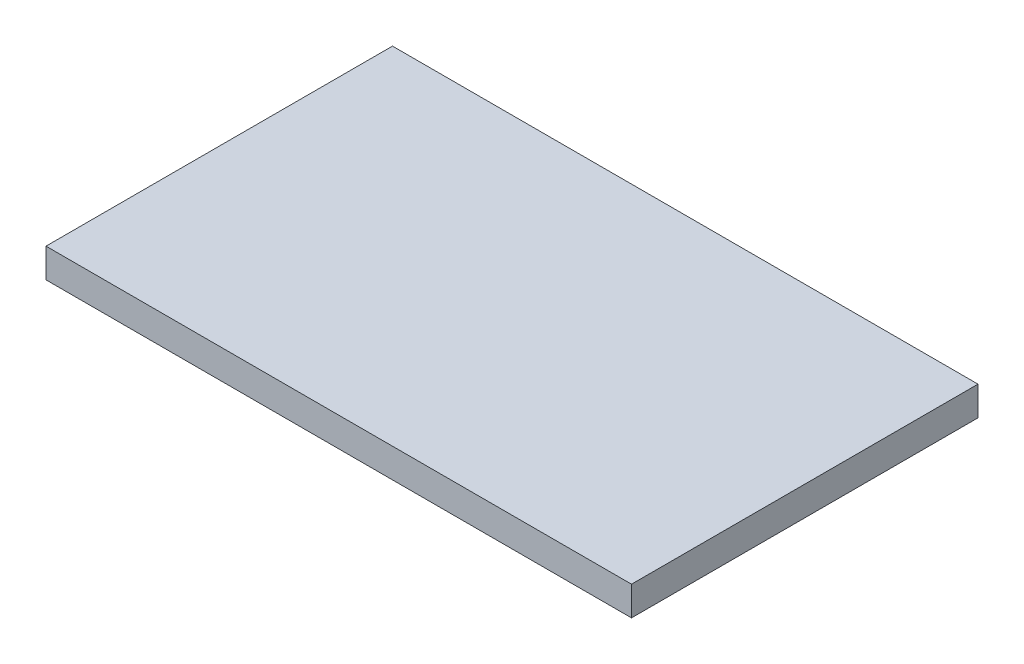
ISO-10303-21;
HEADER;
FILE_DESCRIPTION(('STEP AP214'),'2;1');
FILE_NAME('part.step','',(''),(''),'','','');
FILE_SCHEMA(('AUTOMOTIVE_DESIGN { 1 0 10303 214 1 1 1 1 }'));
ENDSEC;
DATA;
#1=APPLICATION_CONTEXT('core data for automotive mechanical design processes');
#2=APPLICATION_PROTOCOL_DEFINITION('international standard','automotive_design',2000,#1);
#3=PRODUCT_CONTEXT('',#1,'mechanical');
#4=PRODUCT('Part','Part','',(#3));
#5=PRODUCT_RELATED_PRODUCT_CATEGORY('part','',(#4));
#6=PRODUCT_DEFINITION_FORMATION('','',#4);
#7=PRODUCT_DEFINITION_CONTEXT('part definition',#1,'design');
#8=PRODUCT_DEFINITION('design','',#6,#7);
#9=PRODUCT_DEFINITION_SHAPE('','',#8);
#10=(LENGTH_UNIT() NAMED_UNIT(*) SI_UNIT(.MILLI.,.METRE.));
#11=(NAMED_UNIT(*) PLANE_ANGLE_UNIT() SI_UNIT($,.RADIAN.));
#12=(NAMED_UNIT(*) SI_UNIT($,.STERADIAN.) SOLID_ANGLE_UNIT());
#13=UNCERTAINTY_MEASURE_WITH_UNIT(LENGTH_MEASURE(1.E-05),#10,'distance_accuracy_value','');
#14=(GEOMETRIC_REPRESENTATION_CONTEXT(3) GLOBAL_UNCERTAINTY_ASSIGNED_CONTEXT((#13)) GLOBAL_UNIT_ASSIGNED_CONTEXT((#10,
#11,#12)) REPRESENTATION_CONTEXT('',''));
#15=CARTESIAN_POINT('',(0.,0.,0.));
#16=DIRECTION('',(0.,0.,1.));
#17=DIRECTION('',(1.,0.,0.));
#18=AXIS2_PLACEMENT_3D('',#15,#16,#17);
#19=CARTESIAN_POINT('',(0.,0.,0.));
#20=DIRECTION('',(0.,0.,-1.));
#21=DIRECTION('',(-1.,0.,0.));
#22=AXIS2_PLACEMENT_3D('',#19,#20,#21);
#23=PLANE('',#22);
#24=DIRECTION('',(1.,0.,0.));
#25=VECTOR('',#24,1.);
#26=CARTESIAN_POINT('',(190.95,-161.090734030885,0.));
#27=LINE('',#26,#25);
#28=CARTESIAN_POINT('',(-190.95,-161.090734030885,0.));
#29=VERTEX_POINT('',#28);
#30=CARTESIAN_POINT('',(190.95,-161.090734030885,0.));
#31=VERTEX_POINT('',#30);
#32=EDGE_CURVE('E76',#29,#31,#27,.T.);
#33=ORIENTED_EDGE('',*,*,#32,.F.);
#34=DIRECTION('',(0.,-1.,0.));
#35=VECTOR('',#34,1.);
#36=CARTESIAN_POINT('',(-190.95,-151.565734030885,0.));
#37=LINE('',#36,#35);
#38=CARTESIAN_POINT('',(-190.95,-142.040734030885,0.));
#39=VERTEX_POINT('',#38);
#40=EDGE_CURVE('E81',#39,#29,#37,.T.);
#41=ORIENTED_EDGE('',*,*,#40,.F.);
#42=DIRECTION('',(-1.,0.,0.));
#43=VECTOR('',#42,1.);
#44=CARTESIAN_POINT('',(-190.95,-142.040734030885,0.));
#45=LINE('',#44,#43);
#46=CARTESIAN_POINT('',(190.95,-142.040734030885,0.));
#47=VERTEX_POINT('',#46);
#48=EDGE_CURVE('E88',#47,#39,#45,.T.);
#49=ORIENTED_EDGE('',*,*,#48,.F.);
#50=DIRECTION('',(0.,1.,0.));
#51=VECTOR('',#50,1.);
#52=CARTESIAN_POINT('',(190.95,-142.040734030885,0.));
#53=LINE('',#52,#51);
#54=EDGE_CURVE('E91',#31,#47,#53,.T.);
#55=ORIENTED_EDGE('',*,*,#54,.F.);
#56=EDGE_LOOP('',(#33,#41,#49,#55));
#57=FACE_BOUND('',#56,.T.);
#58=ADVANCED_FACE('F33',(#57),#23,.T.);
#59=CARTESIAN_POINT('',(-190.95,-151.565734030885,608.374832461552));
#60=DIRECTION('',(1.,0.,0.));
#61=DIRECTION('',(0.,0.,-1.));
#62=AXIS2_PLACEMENT_3D('',#59,#60,#61);
#63=PLANE('',#62);
#64=DIRECTION('',(0.,0.,-1.));
#65=VECTOR('',#64,1.);
#66=CARTESIAN_POINT('',(-190.95,-161.090734030885,608.374832461552));
#67=LINE('',#66,#65);
#68=CARTESIAN_POINT('',(-190.95,-161.090734030885,226.));
#69=VERTEX_POINT('',#68);
#70=EDGE_CURVE('E72',#69,#29,#67,.T.);
#71=ORIENTED_EDGE('',*,*,#70,.F.);
#72=DIRECTION('',(0.,1.,0.));
#73=VECTOR('',#72,1.);
#74=CARTESIAN_POINT('',(-190.95,-151.565734030885,226.));
#75=LINE('',#74,#73);
#76=CARTESIAN_POINT('',(-190.95,-142.040734030885,226.));
#77=VERTEX_POINT('',#76);
#78=EDGE_CURVE('E37',#69,#77,#75,.T.);
#79=ORIENTED_EDGE('',*,*,#78,.T.);
#80=DIRECTION('',(0.,0.,-1.));
#81=VECTOR('',#80,1.);
#82=CARTESIAN_POINT('',(-190.95,-142.040734030885,608.374832461552));
#83=LINE('',#82,#81);
#84=EDGE_CURVE('E84',#77,#39,#83,.T.);
#85=ORIENTED_EDGE('',*,*,#84,.T.);
#86=ORIENTED_EDGE('',*,*,#40,.T.);
#87=EDGE_LOOP('',(#71,#79,#85,#86));
#88=FACE_BOUND('',#87,.T.);
#89=ADVANCED_FACE('F82',(#88),#63,.F.);
#90=CARTESIAN_POINT('',(-190.95,-142.040734030885,608.374832461552));
#91=DIRECTION('',(0.,-1.,0.));
#92=DIRECTION('',(0.,0.,-1.));
#93=AXIS2_PLACEMENT_3D('',#90,#91,#92);
#94=PLANE('',#93);
#95=ORIENTED_EDGE('',*,*,#84,.F.);
#96=DIRECTION('',(1.,0.,0.));
#97=VECTOR('',#96,1.);
#98=CARTESIAN_POINT('',(-190.95,-142.040734030885,226.));
#99=LINE('',#98,#97);
#100=CARTESIAN_POINT('',(190.95,-142.040734030885,226.));
#101=VERTEX_POINT('',#100);
#102=EDGE_CURVE('E103',#77,#101,#99,.T.);
#103=ORIENTED_EDGE('',*,*,#102,.T.);
#104=DIRECTION('',(0.,0.,-1.));
#105=VECTOR('',#104,1.);
#106=CARTESIAN_POINT('',(190.95,-142.040734030885,608.374832461552));
#107=LINE('',#106,#105);
#108=EDGE_CURVE('E98',#101,#47,#107,.T.);
#109=ORIENTED_EDGE('',*,*,#108,.T.);
#110=ORIENTED_EDGE('',*,*,#48,.T.);
#111=EDGE_LOOP('',(#95,#103,#109,#110));
#112=FACE_BOUND('',#111,.T.);
#113=ADVANCED_FACE('F106',(#112),#94,.F.);
#114=CARTESIAN_POINT('',(190.95,-142.040734030885,608.374832461552));
#115=DIRECTION('',(-1.,0.,0.));
#116=DIRECTION('',(0.,-1.,0.));
#117=AXIS2_PLACEMENT_3D('',#114,#115,#116);
#118=PLANE('',#117);
#119=ORIENTED_EDGE('',*,*,#108,.F.);
#120=DIRECTION('',(0.,-1.,0.));
#121=VECTOR('',#120,1.);
#122=CARTESIAN_POINT('',(190.95,-142.040734030885,226.));
#123=LINE('',#122,#121);
#124=CARTESIAN_POINT('',(190.95,-161.090734030885,226.));
#125=VERTEX_POINT('',#124);
#126=EDGE_CURVE('E42',#101,#125,#123,.T.);
#127=ORIENTED_EDGE('',*,*,#126,.T.);
#128=DIRECTION('',(0.,0.,-1.));
#129=VECTOR('',#128,1.);
#130=CARTESIAN_POINT('',(190.95,-161.090734030885,608.374832461552));
#131=LINE('',#130,#129);
#132=EDGE_CURVE('E79',#125,#31,#131,.T.);
#133=ORIENTED_EDGE('',*,*,#132,.T.);
#134=ORIENTED_EDGE('',*,*,#54,.T.);
#135=EDGE_LOOP('',(#119,#127,#133,#134));
#136=FACE_BOUND('',#135,.T.);
#137=ADVANCED_FACE('F101',(#136),#118,.F.);
#138=CARTESIAN_POINT('',(190.95,-161.090734030885,608.374832461552));
#139=DIRECTION('',(0.,1.,0.));
#140=DIRECTION('',(0.,0.,1.));
#141=AXIS2_PLACEMENT_3D('',#138,#139,#140);
#142=PLANE('',#141);
#143=ORIENTED_EDGE('',*,*,#132,.F.);
#144=DIRECTION('',(-1.,0.,0.));
#145=VECTOR('',#144,1.);
#146=CARTESIAN_POINT('',(190.95,-161.090734030885,226.));
#147=LINE('',#146,#145);
#148=EDGE_CURVE('E11',#125,#69,#147,.T.);
#149=ORIENTED_EDGE('',*,*,#148,.T.);
#150=ORIENTED_EDGE('',*,*,#70,.T.);
#151=ORIENTED_EDGE('',*,*,#32,.T.);
#152=EDGE_LOOP('',(#143,#149,#150,#151));
#153=FACE_BOUND('',#152,.T.);
#154=ADVANCED_FACE('F35',(#153),#142,.F.);
#155=CARTESIAN_POINT('',(400.95,0.,226.));
#156=DIRECTION('',(0.,0.,-1.));
#157=DIRECTION('',(-1.,0.,0.));
#158=AXIS2_PLACEMENT_3D('',#155,#156,#157);
#159=PLANE('',#158);
#160=ORIENTED_EDGE('',*,*,#126,.F.);
#161=ORIENTED_EDGE('',*,*,#102,.F.);
#162=ORIENTED_EDGE('',*,*,#78,.F.);
#163=ORIENTED_EDGE('',*,*,#148,.F.);
#164=EDGE_LOOP('',(#160,#161,#162,#163));
#165=FACE_BOUND('',#164,.T.);
#166=ADVANCED_FACE('F107',(#165),#159,.F.);
#167=CLOSED_SHELL('',(#58,#89,#113,#137,#154,#166));
#168=MANIFOLD_SOLID_BREP('B2',#167);
#169=ADVANCED_BREP_SHAPE_REPRESENTATION('',(#18,#168),#14);
#170=SHAPE_DEFINITION_REPRESENTATION(#9,#169);
ENDSEC;
END-ISO-10303-21;
